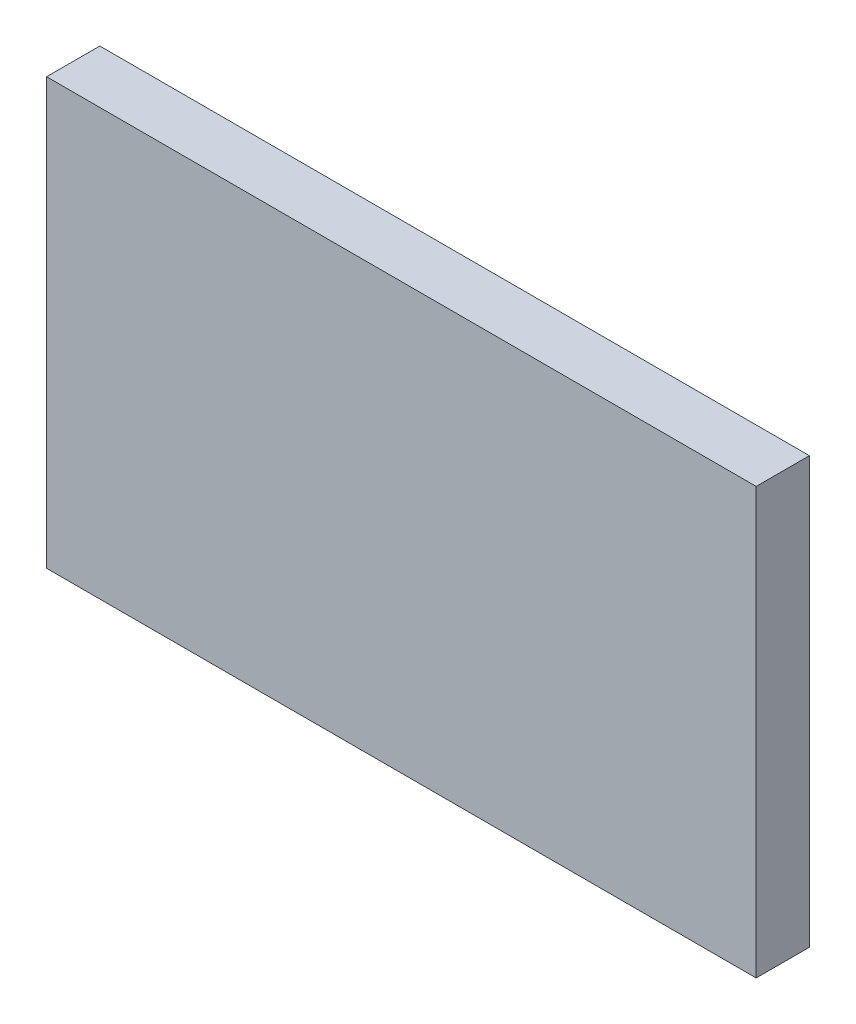
ISO-10303-21;
HEADER;
FILE_DESCRIPTION(('STEP AP214'),'2;1');
FILE_NAME('part.step','',(''),(''),'','','');
FILE_SCHEMA(('AUTOMOTIVE_DESIGN { 1 0 10303 214 1 1 1 1 }'));
ENDSEC;
DATA;
#1=APPLICATION_CONTEXT('core data for automotive mechanical design processes');
#2=APPLICATION_PROTOCOL_DEFINITION('international standard','automotive_design',2000,#1);
#3=PRODUCT_CONTEXT('',#1,'mechanical');
#4=PRODUCT('Part','Part','',(#3));
#5=PRODUCT_RELATED_PRODUCT_CATEGORY('part','',(#4));
#6=PRODUCT_DEFINITION_FORMATION('','',#4);
#7=PRODUCT_DEFINITION_CONTEXT('part definition',#1,'design');
#8=PRODUCT_DEFINITION('design','',#6,#7);
#9=PRODUCT_DEFINITION_SHAPE('','',#8);
#10=(LENGTH_UNIT() NAMED_UNIT(*) SI_UNIT(.MILLI.,.METRE.));
#11=(NAMED_UNIT(*) PLANE_ANGLE_UNIT() SI_UNIT($,.RADIAN.));
#12=(NAMED_UNIT(*) SI_UNIT($,.STERADIAN.) SOLID_ANGLE_UNIT());
#13=UNCERTAINTY_MEASURE_WITH_UNIT(LENGTH_MEASURE(1.E-05),#10,'distance_accuracy_value','');
#14=(GEOMETRIC_REPRESENTATION_CONTEXT(3) GLOBAL_UNCERTAINTY_ASSIGNED_CONTEXT((#13)) GLOBAL_UNIT_ASSIGNED_CONTEXT((#10,
#11,#12)) REPRESENTATION_CONTEXT('',''));
#15=CARTESIAN_POINT('',(0.,0.,0.));
#16=DIRECTION('',(0.,0.,1.));
#17=DIRECTION('',(1.,0.,0.));
#18=AXIS2_PLACEMENT_3D('',#15,#16,#17);
#19=CARTESIAN_POINT('',(0.,0.,9.525));
#20=DIRECTION('',(1.,0.,0.));
#21=DIRECTION('',(0.,0.,-1.));
#22=AXIS2_PLACEMENT_3D('',#19,#20,#21);
#23=PLANE('',#22);
#24=DIRECTION('',(0.,-1.,0.));
#25=VECTOR('',#24,1.);
#26=CARTESIAN_POINT('',(0.,0.,0.));
#27=LINE('',#26,#25);
#28=CARTESIAN_POINT('',(0.,76.2,0.));
#29=VERTEX_POINT('',#28);
#30=CARTESIAN_POINT('',(0.,0.,0.));
#31=VERTEX_POINT('',#30);
#32=EDGE_CURVE('E105',#29,#31,#27,.T.);
#33=ORIENTED_EDGE('',*,*,#32,.T.);
#34=DIRECTION('',(0.,0.,-1.));
#35=VECTOR('',#34,1.);
#36=CARTESIAN_POINT('',(0.,0.,9.525));
#37=LINE('',#36,#35);
#38=CARTESIAN_POINT('',(0.,0.,9.525));
#39=VERTEX_POINT('',#38);
#40=EDGE_CURVE('E11',#39,#31,#37,.T.);
#41=ORIENTED_EDGE('',*,*,#40,.F.);
#42=DIRECTION('',(0.,-1.,0.));
#43=VECTOR('',#42,1.);
#44=CARTESIAN_POINT('',(0.,0.,9.525));
#45=LINE('',#44,#43);
#46=CARTESIAN_POINT('',(0.,76.2,9.525));
#47=VERTEX_POINT('',#46);
#48=EDGE_CURVE('E89',#47,#39,#45,.T.);
#49=ORIENTED_EDGE('',*,*,#48,.F.);
#50=DIRECTION('',(0.,0.,-1.));
#51=VECTOR('',#50,1.);
#52=CARTESIAN_POINT('',(0.,76.2,9.525));
#53=LINE('',#52,#51);
#54=EDGE_CURVE('E98',#47,#29,#53,.T.);
#55=ORIENTED_EDGE('',*,*,#54,.T.);
#56=EDGE_LOOP('',(#33,#41,#49,#55));
#57=FACE_BOUND('',#56,.T.);
#58=ADVANCED_FACE('F39',(#57),#23,.F.);
#59=CARTESIAN_POINT('',(0.,0.,9.525));
#60=DIRECTION('',(0.,1.,0.));
#61=DIRECTION('',(0.,0.,1.));
#62=AXIS2_PLACEMENT_3D('',#59,#60,#61);
#63=PLANE('',#62);
#64=DIRECTION('',(1.,0.,0.));
#65=VECTOR('',#64,1.);
#66=CARTESIAN_POINT('',(0.,0.,0.));
#67=LINE('',#66,#65);
#68=CARTESIAN_POINT('',(127.,0.,0.));
#69=VERTEX_POINT('',#68);
#70=EDGE_CURVE('E94',#31,#69,#67,.T.);
#71=ORIENTED_EDGE('',*,*,#70,.T.);
#72=DIRECTION('',(0.,0.,-1.));
#73=VECTOR('',#72,1.);
#74=CARTESIAN_POINT('',(127.,0.,9.525));
#75=LINE('',#74,#73);
#76=CARTESIAN_POINT('',(127.,0.,9.525));
#77=VERTEX_POINT('',#76);
#78=EDGE_CURVE('E50',#77,#69,#75,.T.);
#79=ORIENTED_EDGE('',*,*,#78,.F.);
#80=DIRECTION('',(1.,0.,0.));
#81=VECTOR('',#80,1.);
#82=CARTESIAN_POINT('',(0.,0.,9.525));
#83=LINE('',#82,#81);
#84=EDGE_CURVE('E85',#39,#77,#83,.T.);
#85=ORIENTED_EDGE('',*,*,#84,.F.);
#86=ORIENTED_EDGE('',*,*,#40,.T.);
#87=EDGE_LOOP('',(#71,#79,#85,#86));
#88=FACE_BOUND('',#87,.T.);
#89=ADVANCED_FACE('F91',(#88),#63,.F.);
#90=CARTESIAN_POINT('',(127.,0.,9.525));
#91=DIRECTION('',(-1.,0.,0.));
#92=DIRECTION('',(0.,0.,1.));
#93=AXIS2_PLACEMENT_3D('',#90,#91,#92);
#94=PLANE('',#93);
#95=DIRECTION('',(0.,1.,0.));
#96=VECTOR('',#95,1.);
#97=CARTESIAN_POINT('',(127.,0.,0.));
#98=LINE('',#97,#96);
#99=CARTESIAN_POINT('',(127.,76.2,0.));
#100=VERTEX_POINT('',#99);
#101=EDGE_CURVE('E75',#69,#100,#98,.T.);
#102=ORIENTED_EDGE('',*,*,#101,.T.);
#103=DIRECTION('',(0.,0.,-1.));
#104=VECTOR('',#103,1.);
#105=CARTESIAN_POINT('',(127.,76.2,9.525));
#106=LINE('',#105,#104);
#107=CARTESIAN_POINT('',(127.,76.2,9.525));
#108=VERTEX_POINT('',#107);
#109=EDGE_CURVE('E92',#108,#100,#106,.T.);
#110=ORIENTED_EDGE('',*,*,#109,.F.);
#111=DIRECTION('',(0.,1.,0.));
#112=VECTOR('',#111,1.);
#113=CARTESIAN_POINT('',(127.,0.,9.525));
#114=LINE('',#113,#112);
#115=EDGE_CURVE('E86',#77,#108,#114,.T.);
#116=ORIENTED_EDGE('',*,*,#115,.F.);
#117=ORIENTED_EDGE('',*,*,#78,.T.);
#118=EDGE_LOOP('',(#102,#110,#116,#117));
#119=FACE_BOUND('',#118,.T.);
#120=ADVANCED_FACE('F96',(#119),#94,.F.);
#121=CARTESIAN_POINT('',(0.,76.2,9.525));
#122=DIRECTION('',(0.,-1.,0.));
#123=DIRECTION('',(0.,0.,-1.));
#124=AXIS2_PLACEMENT_3D('',#121,#122,#123);
#125=PLANE('',#124);
#126=DIRECTION('',(-1.,0.,0.));
#127=VECTOR('',#126,1.);
#128=CARTESIAN_POINT('',(0.,76.2,0.));
#129=LINE('',#128,#127);
#130=EDGE_CURVE('E79',#100,#29,#129,.T.);
#131=ORIENTED_EDGE('',*,*,#130,.T.);
#132=ORIENTED_EDGE('',*,*,#54,.F.);
#133=DIRECTION('',(-1.,0.,0.));
#134=VECTOR('',#133,1.);
#135=CARTESIAN_POINT('',(0.,76.2,9.525));
#136=LINE('',#135,#134);
#137=EDGE_CURVE('E54',#108,#47,#136,.T.);
#138=ORIENTED_EDGE('',*,*,#137,.F.);
#139=ORIENTED_EDGE('',*,*,#109,.T.);
#140=EDGE_LOOP('',(#131,#132,#138,#139));
#141=FACE_BOUND('',#140,.T.);
#142=ADVANCED_FACE('F108',(#141),#125,.F.);
#143=CARTESIAN_POINT('',(0.,0.,9.525));
#144=DIRECTION('',(0.,0.,-1.));
#145=DIRECTION('',(-1.,0.,0.));
#146=AXIS2_PLACEMENT_3D('',#143,#144,#145);
#147=PLANE('',#146);
#148=ORIENTED_EDGE('',*,*,#48,.T.);
#149=ORIENTED_EDGE('',*,*,#84,.T.);
#150=ORIENTED_EDGE('',*,*,#115,.T.);
#151=ORIENTED_EDGE('',*,*,#137,.T.);
#152=EDGE_LOOP('',(#148,#149,#150,#151));
#153=FACE_BOUND('',#152,.T.);
#154=ADVANCED_FACE('F88',(#153),#147,.F.);
#155=CARTESIAN_POINT('',(0.,0.,0.));
#156=DIRECTION('',(0.,0.,-1.));
#157=DIRECTION('',(-1.,0.,0.));
#158=AXIS2_PLACEMENT_3D('',#155,#156,#157);
#159=PLANE('',#158);
#160=ORIENTED_EDGE('',*,*,#32,.F.);
#161=ORIENTED_EDGE('',*,*,#130,.F.);
#162=ORIENTED_EDGE('',*,*,#101,.F.);
#163=ORIENTED_EDGE('',*,*,#70,.F.);
#164=EDGE_LOOP('',(#160,#161,#162,#163));
#165=FACE_BOUND('',#164,.T.);
#166=ADVANCED_FACE('F115',(#165),#159,.T.);
#167=CLOSED_SHELL('',(#58,#89,#120,#142,#154,#166));
#168=MANIFOLD_SOLID_BREP('B2',#167);
#169=ADVANCED_BREP_SHAPE_REPRESENTATION('',(#18,#168),#14);
#170=SHAPE_DEFINITION_REPRESENTATION(#9,#169);
ENDSEC;
END-ISO-10303-21;
